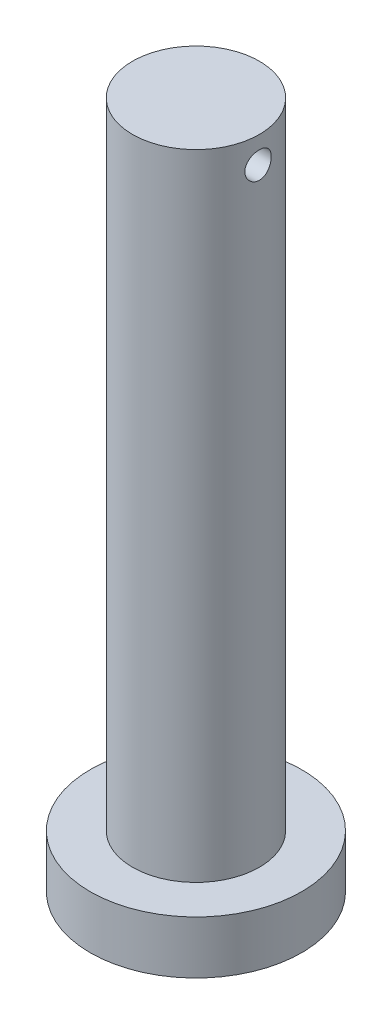
ISO-10303-21;
HEADER;
FILE_DESCRIPTION(('STEP AP214'),'2;1');
FILE_NAME('part.step','',(''),(''),'','','');
FILE_SCHEMA(('AUTOMOTIVE_DESIGN { 1 0 10303 214 1 1 1 1 }'));
ENDSEC;
DATA;
#1=APPLICATION_CONTEXT('core data for automotive mechanical design processes');
#2=APPLICATION_PROTOCOL_DEFINITION('international standard','automotive_design',2000,#1);
#3=PRODUCT_CONTEXT('',#1,'mechanical');
#4=PRODUCT('Part','Part','',(#3));
#5=PRODUCT_RELATED_PRODUCT_CATEGORY('part','',(#4));
#6=PRODUCT_DEFINITION_FORMATION('','',#4);
#7=PRODUCT_DEFINITION_CONTEXT('part definition',#1,'design');
#8=PRODUCT_DEFINITION('design','',#6,#7);
#9=PRODUCT_DEFINITION_SHAPE('','',#8);
#10=(LENGTH_UNIT() NAMED_UNIT(*) SI_UNIT(.MILLI.,.METRE.));
#11=(NAMED_UNIT(*) PLANE_ANGLE_UNIT() SI_UNIT($,.RADIAN.));
#12=(NAMED_UNIT(*) SI_UNIT($,.STERADIAN.) SOLID_ANGLE_UNIT());
#13=UNCERTAINTY_MEASURE_WITH_UNIT(LENGTH_MEASURE(1.E-05),#10,'distance_accuracy_value','');
#14=(GEOMETRIC_REPRESENTATION_CONTEXT(3) GLOBAL_UNCERTAINTY_ASSIGNED_CONTEXT((#13)) GLOBAL_UNIT_ASSIGNED_CONTEXT((#10,
#11,#12)) REPRESENTATION_CONTEXT('',''));
#15=CARTESIAN_POINT('',(0.,0.,0.));
#16=DIRECTION('',(0.,0.,1.));
#17=DIRECTION('',(1.,0.,0.));
#18=AXIS2_PLACEMENT_3D('',#15,#16,#17);
#19=CARTESIAN_POINT('',(0.,60.,0.));
#20=DIRECTION('',(0.,-1.,0.));
#21=DIRECTION('',(0.,0.,-1.));
#22=AXIS2_PLACEMENT_3D('',#19,#20,#21);
#23=CYLINDRICAL_SURFACE('',#22,6.);
#24=CARTESIAN_POINT('',(-5.86834729715275,57.5,-1.25));
#25=CARTESIAN_POINT('',(-5.86834869213645,57.569390615151,-1.249997508776));
#26=CARTESIAN_POINT('',(-5.86959145924544,57.6388119720152,-1.24420229433948));
#27=CARTESIAN_POINT('',(-5.87442015581798,57.7756863173172,-1.22119649233779));
#28=CARTESIAN_POINT('',(-5.87800788138388,57.8431377555064,-1.20397715440342));
#29=CARTESIAN_POINT('',(-5.8871029296193,57.9740723728349,-1.15868397507231));
#30=CARTESIAN_POINT('',(-5.89260825706945,58.0375595959918,-1.13062141248933));
#31=CARTESIAN_POINT('',(-5.90491581335741,58.1589244996456,-1.06446988601733));
#32=CARTESIAN_POINT('',(-5.91171798977622,58.21680240673,-1.0263813273582));
#33=CARTESIAN_POINT('',(-5.92596934661468,58.3261953751535,-0.940636399466089));
#34=CARTESIAN_POINT('',(-5.93342614373039,58.3776118936265,-0.892855554869674));
#35=CARTESIAN_POINT('',(-5.94807966802575,58.4717610686481,-0.789351223880641));
#36=CARTESIAN_POINT('',(-5.95527637609915,58.5144930882914,-0.733627155456006));
#37=CARTESIAN_POINT('',(-5.96868135118848,58.5904458880829,-0.615162052999591));
#38=CARTESIAN_POINT('',(-5.97487958631242,58.6235725264633,-0.552359428204943));
#39=CARTESIAN_POINT('',(-5.98550347343302,58.6787660528598,-0.421928551006721));
#40=CARTESIAN_POINT('',(-5.98992930561223,58.7008340651535,-0.354300789950593));
#41=CARTESIAN_POINT('',(-5.99645589892179,58.7329757611175,-0.217162904200505));
#42=CARTESIAN_POINT('',(-5.99858891959926,58.7432160171952,-0.14769338091636));
#43=CARTESIAN_POINT('',(-6.00040112580612,58.751931695757,-0.00799184883952697));
#44=CARTESIAN_POINT('',(-6.0000805670369,58.7504083441931,0.062240079736836));
#45=CARTESIAN_POINT('',(-5.99704658090511,58.7357653990433,0.200326586199569));
#46=CARTESIAN_POINT('',(-5.99437018956585,58.7228252810419,0.268201128726472));
#47=CARTESIAN_POINT('',(-5.98696720898885,58.6860013746687,0.40079374628975));
#48=CARTESIAN_POINT('',(-5.98224053291904,58.6621171227969,0.46551168751102));
#49=CARTESIAN_POINT('',(-5.97120767323924,58.6039199478745,0.590460005384681));
#50=CARTESIAN_POINT('',(-5.96489104125346,58.5695377057903,0.650657134981646));
#51=CARTESIAN_POINT('',(-5.95137300440189,58.4913719971596,0.764493456510644));
#52=CARTESIAN_POINT('',(-5.94417148958325,58.4475873617939,0.818131831816417));
#53=CARTESIAN_POINT('',(-5.92951700233276,58.3508783751089,0.918394203276914));
#54=CARTESIAN_POINT('',(-5.92206184975925,58.297796940018,0.964866487494797));
#55=CARTESIAN_POINT('',(-5.90786872648996,58.1845179510052,1.04827597240488));
#56=CARTESIAN_POINT('',(-5.9011307717716,58.1243202386128,1.0852129606998));
#57=CARTESIAN_POINT('',(-5.88912998409156,57.9982877451712,1.14856217138454));
#58=CARTESIAN_POINT('',(-5.88387085232125,57.9324393493065,1.17494805489727));
#59=CARTESIAN_POINT('',(-5.8754760641036,57.7971083806306,1.21623577538673));
#60=CARTESIAN_POINT('',(-5.87234010507182,57.7276263271919,1.23113924882349));
#61=CARTESIAN_POINT('',(-5.86860783239132,57.5883802936811,1.24880863867017));
#62=CARTESIAN_POINT('',(-5.86796551863474,57.518645415463,1.25179442917998));
#63=CARTESIAN_POINT('',(-5.86916952018704,57.3796741884599,1.24613693439294));
#64=CARTESIAN_POINT('',(-5.87101568152624,57.3104378090977,1.23749436857863));
#65=CARTESIAN_POINT('',(-5.87694538226166,57.1751794839419,1.20901558325484));
#66=CARTESIAN_POINT('',(-5.88100511282998,57.1091313328212,1.18929841376871));
#67=CARTESIAN_POINT('',(-5.8908833850312,56.9812760105584,1.13935810860919));
#68=CARTESIAN_POINT('',(-5.89670208191057,56.9194692143496,1.10913404556146));
#69=CARTESIAN_POINT('',(-5.90954501937191,56.8008935587838,1.03854598181484));
#70=CARTESIAN_POINT('',(-5.91658506648323,56.7442077955338,0.998045327353961));
#71=CARTESIAN_POINT('',(-5.93103483993908,56.6383567508449,0.908234440569878));
#72=CARTESIAN_POINT('',(-5.93844460766532,56.5891923137608,0.858923220505172));
#73=CARTESIAN_POINT('',(-5.95294924316736,56.4989372869028,0.751900450843339));
#74=CARTESIAN_POINT('',(-5.9600367471991,56.4579959049736,0.694061907614551));
#75=CARTESIAN_POINT('',(-5.97296708772407,56.386411247912,0.572200102216361));
#76=CARTESIAN_POINT('',(-5.97880997920818,56.3557675177625,0.508177113476883));
#77=CARTESIAN_POINT('',(-5.98856148270679,56.3058613206826,0.376142117847921));
#78=CARTESIAN_POINT('',(-5.99248163136497,56.2865308344557,0.308156710970196));
#79=CARTESIAN_POINT('',(-5.99799561410226,56.2595855959919,0.169813400503474));
#80=CARTESIAN_POINT('',(-5.99958975342889,56.2519693064673,0.0994558094616968));
#81=CARTESIAN_POINT('',(-6.00026408056941,56.2487323779515,-0.040213343470338));
#82=CARTESIAN_POINT('',(-5.99939113754811,56.2528881000053,-0.109519592177921));
#83=CARTESIAN_POINT('',(-5.99532874094472,56.2725806386529,-0.246422870373552));
#84=CARTESIAN_POINT('',(-5.99213932172839,56.2881172864068,-0.314019925202703));
#85=CARTESIAN_POINT('',(-5.98380460077544,56.3300277946486,-0.445431965492053));
#86=CARTESIAN_POINT('',(-5.97866453407556,56.3563726638531,-0.509256550004524));
#87=CARTESIAN_POINT('',(-5.96697995347704,56.419122397732,-0.631610567220743));
#88=CARTESIAN_POINT('',(-5.96043531730246,56.4555281383431,-0.690139538279512));
#89=CARTESIAN_POINT('',(-5.94651596786386,56.5381096679933,-0.801340321298262));
#90=CARTESIAN_POINT('',(-5.93912880302851,56.5844442880567,-0.853892633615928));
#91=CARTESIAN_POINT('',(-5.9244278681135,56.6852445009971,-0.950552741980386));
#92=CARTESIAN_POINT('',(-5.91711411595368,56.7397120299484,-0.994658521571231));
#93=CARTESIAN_POINT('',(-5.90329191643327,56.8560091024334,-1.07367451852767));
#94=CARTESIAN_POINT('',(-5.89679406702551,56.9179184114621,-1.10846928126994));
#95=CARTESIAN_POINT('',(-5.88547039658063,57.0468251560833,-1.16710627925306));
#96=CARTESIAN_POINT('',(-5.88064310352601,57.113818048453,-1.1909581629246));
#97=CARTESIAN_POINT('',(-5.87414004405196,57.2341062815684,-1.22256554131861));
#98=CARTESIAN_POINT('',(-5.87198163591589,57.2867295365931,-1.2328344900567));
#99=CARTESIAN_POINT('',(-5.86908475266778,57.392895780521,-1.24655254358404));
#100=CARTESIAN_POINT('',(-5.86834622039193,57.44643873231,-1.25000192292741));
#101=CARTESIAN_POINT('',(-5.86834729715275,57.5,-1.25));
#102=B_SPLINE_CURVE_WITH_KNOTS('',3,(#24,#25,#26,#27,#28,#29,#30,#31,#32,#33,#34,#35,#36,#37,
#38,#39,#40,#41,#42,#43,#44,#45,#46,#47,#48,#49,#50,#51,#52,#53,#54,#55,#56,#57,#58,#59,#60,#61,
#62,#63,#64,#65,#66,#67,#68,#69,#70,#71,#72,#73,#74,#75,#76,#77,#78,#79,#80,#81,#82,#83,#84,#85,
#86,#87,#88,#89,#90,#91,#92,#93,#94,#95,#96,#97,#98,#99,#100,#101),.UNSPECIFIED.,.T.,.F.,(4,2,2,
2,2,2,2,2,2,2,2,2,2,2,2,2,2,2,2,2,2,2,2,2,2,2,2,2,2,2,2,2,2,2,2,2,2,2,4),(0.,0.20797565407127,
0.41611079241747,0.624030014802724,0.831940834815788,1.04271333467884,1.25350128663874,
1.46629026266844,1.67905760106933,1.88879048859265,2.09850151896339,2.30497341416461,
2.51145405455871,2.71932871977949,2.9272292410426,3.13905862244914,3.35089272191629,
3.5632523733249,3.77558175387597,3.98397516009791,4.19235567296524,4.39853786231922,
4.60473825464031,4.81383917934652,5.02296356082187,5.23559458753344,5.44821621759041,
5.65954599648535,5.87084803959582,6.07816293922645,6.28547476332982,6.49223410585102,
6.69901145528174,6.90938318978574,7.11980508427536,7.33272651358124,7.54545984571989,
7.70599867585771,7.86653104261162),.UNSPECIFIED.);
#103=CARTESIAN_POINT('',(-5.86834729715275,57.5,-1.25));
#104=VERTEX_POINT('',#103);
#105=EDGE_CURVE('E36',#104,#104,#102,.T.);
#106=ORIENTED_EDGE('',*,*,#105,.T.);
#107=EDGE_LOOP('',(#106));
#108=FACE_BOUND('',#107,.T.);
#109=CARTESIAN_POINT('',(5.86834729715275,57.5,-1.25));
#110=CARTESIAN_POINT('',(5.86834869213645,57.430609384849,-1.249997508776));
#111=CARTESIAN_POINT('',(5.86959145924544,57.3611880279848,-1.24420229433948));
#112=CARTESIAN_POINT('',(5.87442015581798,57.2243136826827,-1.22119649233779));
#113=CARTESIAN_POINT('',(5.87800788138388,57.1568622444936,-1.20397715440342));
#114=CARTESIAN_POINT('',(5.8871029296193,57.0259276271651,-1.15868397507231));
#115=CARTESIAN_POINT('',(5.89260825706945,56.9624404040082,-1.13062141248933));
#116=CARTESIAN_POINT('',(5.90491581335741,56.8410755003544,-1.06446988601733));
#117=CARTESIAN_POINT('',(5.91171798977622,56.78319759327,-1.0263813273582));
#118=CARTESIAN_POINT('',(5.92596934661468,56.6738046248465,-0.940636399466089));
#119=CARTESIAN_POINT('',(5.93342614373039,56.6223881063735,-0.892855554869674));
#120=CARTESIAN_POINT('',(5.94807966802575,56.5282389313519,-0.789351223880641));
#121=CARTESIAN_POINT('',(5.95527637609915,56.4855069117086,-0.733627155456006));
#122=CARTESIAN_POINT('',(5.96868135118848,56.4095541119171,-0.615162052999591));
#123=CARTESIAN_POINT('',(5.97487958631242,56.3764274735367,-0.552359428204943));
#124=CARTESIAN_POINT('',(5.98550347343302,56.3212339471402,-0.421928551006721));
#125=CARTESIAN_POINT('',(5.98992930561223,56.2991659348465,-0.354300789950593));
#126=CARTESIAN_POINT('',(5.99645589892179,56.2670242388825,-0.217162904200505));
#127=CARTESIAN_POINT('',(5.99858891959926,56.2567839828048,-0.14769338091636));
#128=CARTESIAN_POINT('',(6.00040112580612,56.248068304243,-0.00799184883952697));
#129=CARTESIAN_POINT('',(6.0000805670369,56.2495916558069,0.062240079736836));
#130=CARTESIAN_POINT('',(5.99704658090511,56.2642346009567,0.200326586199569));
#131=CARTESIAN_POINT('',(5.99437018956585,56.2771747189581,0.268201128726472));
#132=CARTESIAN_POINT('',(5.98696720898885,56.3139986253313,0.40079374628975));
#133=CARTESIAN_POINT('',(5.98224053291904,56.3378828772031,0.46551168751102));
#134=CARTESIAN_POINT('',(5.97120767323924,56.3960800521255,0.590460005384681));
#135=CARTESIAN_POINT('',(5.96489104125346,56.4304622942096,0.650657134981646));
#136=CARTESIAN_POINT('',(5.95137300440189,56.5086280028404,0.764493456510644));
#137=CARTESIAN_POINT('',(5.94417148958325,56.5524126382061,0.818131831816417));
#138=CARTESIAN_POINT('',(5.92951700233276,56.649121624891,0.918394203276911));
#139=CARTESIAN_POINT('',(5.92206184975926,56.7022030599819,0.964866487494792));
#140=CARTESIAN_POINT('',(5.90786872648996,56.8154820489948,1.04827597240488));
#141=CARTESIAN_POINT('',(5.9011307717716,56.8756797613872,1.0852129606998));
#142=CARTESIAN_POINT('',(5.88912998409156,57.0017122548288,1.14856217138454));
#143=CARTESIAN_POINT('',(5.88387085232125,57.0675606506934,1.17494805489727));
#144=CARTESIAN_POINT('',(5.8754760641036,57.2028916193694,1.21623577538672));
#145=CARTESIAN_POINT('',(5.87234010507182,57.2723736728081,1.23113924882348));
#146=CARTESIAN_POINT('',(5.86860783239132,57.4116197063189,1.24880863867017));
#147=CARTESIAN_POINT('',(5.86796551863474,57.481354584537,1.25179442917998));
#148=CARTESIAN_POINT('',(5.86916952018704,57.6203258115401,1.24613693439294));
#149=CARTESIAN_POINT('',(5.87101568152624,57.6895621909023,1.23749436857863));
#150=CARTESIAN_POINT('',(5.87694538226166,57.8248205160581,1.20901558325484));
#151=CARTESIAN_POINT('',(5.88100511282998,57.8908686671788,1.18929841376871));
#152=CARTESIAN_POINT('',(5.8908833850312,58.0187239894416,1.13935810860919));
#153=CARTESIAN_POINT('',(5.89670208191057,58.0805307856504,1.10913404556146));
#154=CARTESIAN_POINT('',(5.90954501937191,58.1991064412162,1.03854598181485));
#155=CARTESIAN_POINT('',(5.91658506648323,58.2557922044662,0.998045327353962));
#156=CARTESIAN_POINT('',(5.93103483993908,58.3616432491551,0.90823444056988));
#157=CARTESIAN_POINT('',(5.93844460766532,58.4108076862392,0.858923220505173));
#158=CARTESIAN_POINT('',(5.95294924316736,58.5010627130972,0.751900450843339));
#159=CARTESIAN_POINT('',(5.9600367471991,58.5420040950264,0.694061907614551));
#160=CARTESIAN_POINT('',(5.97296708772407,58.613588752088,0.572200102216361));
#161=CARTESIAN_POINT('',(5.97880997920818,58.6442324822374,0.508177113476883));
#162=CARTESIAN_POINT('',(5.98856148270679,58.6941386793173,0.376142117847921));
#163=CARTESIAN_POINT('',(5.99248163136497,58.7134691655443,0.308156710970196));
#164=CARTESIAN_POINT('',(5.99799561410226,58.7404144040081,0.169813400503474));
#165=CARTESIAN_POINT('',(5.99958975342889,58.7480306935327,0.0994558094616968));
#166=CARTESIAN_POINT('',(6.00026408056941,58.7512676220485,-0.040213343470338));
#167=CARTESIAN_POINT('',(5.99939113754811,58.7471118999947,-0.109519592177921));
#168=CARTESIAN_POINT('',(5.99532874094472,58.7274193613471,-0.246422870373552));
#169=CARTESIAN_POINT('',(5.99213932172839,58.7118827135932,-0.314019925202703));
#170=CARTESIAN_POINT('',(5.98380460077544,58.6699722053514,-0.445431965492053));
#171=CARTESIAN_POINT('',(5.97866453407556,58.6436273361469,-0.509256550004524));
#172=CARTESIAN_POINT('',(5.96697995347704,58.580877602268,-0.631610567220743));
#173=CARTESIAN_POINT('',(5.96043531730246,58.5444718616569,-0.690139538279512));
#174=CARTESIAN_POINT('',(5.94651596786386,58.4618903320067,-0.801340321298262));
#175=CARTESIAN_POINT('',(5.93912880302851,58.4155557119433,-0.853892633615928));
#176=CARTESIAN_POINT('',(5.9244278681135,58.3147554990029,-0.950552741980386));
#177=CARTESIAN_POINT('',(5.91711411595368,58.2602879700516,-0.994658521571231));
#178=CARTESIAN_POINT('',(5.90329191643327,58.1439908975666,-1.07367451852767));
#179=CARTESIAN_POINT('',(5.89679406702551,58.0820815885379,-1.10846928126994));
#180=CARTESIAN_POINT('',(5.88547039658063,57.9531748439167,-1.16710627925306));
#181=CARTESIAN_POINT('',(5.88064310352601,57.886181951547,-1.1909581629246));
#182=CARTESIAN_POINT('',(5.87414004405196,57.7658937184316,-1.22256554131861));
#183=CARTESIAN_POINT('',(5.87198163591589,57.7132704634069,-1.23283449005671));
#184=CARTESIAN_POINT('',(5.86908475266778,57.607104219479,-1.24655254358404));
#185=CARTESIAN_POINT('',(5.86834622039193,57.55356126769,-1.25000192292741));
#186=CARTESIAN_POINT('',(5.86834729715275,57.5,-1.25));
#187=B_SPLINE_CURVE_WITH_KNOTS('',3,(#109,#110,#111,#112,#113,#114,#115,#116,#117,#118,#119,
#120,#121,#122,#123,#124,#125,#126,#127,#128,#129,#130,#131,#132,#133,#134,#135,#136,#137,#138,
#139,#140,#141,#142,#143,#144,#145,#146,#147,#148,#149,#150,#151,#152,#153,#154,#155,#156,#157,
#158,#159,#160,#161,#162,#163,#164,#165,#166,#167,#168,#169,#170,#171,#172,#173,#174,#175,#176,
#177,#178,#179,#180,#181,#182,#183,#184,#185,#186),.UNSPECIFIED.,.T.,.F.,(4,2,2,2,2,2,2,2,2,2,2,
2,2,2,2,2,2,2,2,2,2,2,2,2,2,2,2,2,2,2,2,2,2,2,2,2,2,2,4),(0.,0.20797565407127,0.41611079241747,
0.624030014802731,0.831940834815788,1.04271333467884,1.25350128663874,1.46629026266844,
1.67905760106933,1.88879048859265,2.09850151896339,2.30497341416461,2.51145405455871,
2.71932871977949,2.9272292410426,3.13905862244913,3.35089272191629,3.56325237332487,
3.77558175387597,3.98397516009791,4.19235567296524,4.39853786231923,4.60473825464031,
4.81383917934651,5.02296356082187,5.23559458753344,5.44821621759041,5.65954599648535,
5.87084803959582,6.07816293922645,6.28547476332982,6.49223410585102,6.69901145528174,
6.90938318978574,7.11980508427536,7.33272651358124,7.54545984571989,7.70599867585771,
7.86653104261162),.UNSPECIFIED.);
#188=CARTESIAN_POINT('',(5.86834729715275,57.5,-1.25));
#189=VERTEX_POINT('',#188);
#190=EDGE_CURVE('E53',#189,#189,#187,.T.);
#191=ORIENTED_EDGE('',*,*,#190,.T.);
#192=EDGE_LOOP('',(#191));
#193=FACE_BOUND('',#192,.T.);
#194=CARTESIAN_POINT('',(0.,60.,0.));
#195=DIRECTION('',(0.,1.,0.));
#196=DIRECTION('',(0.,0.,1.));
#197=AXIS2_PLACEMENT_3D('',#194,#195,#196);
#198=CIRCLE('',#197,6.);
#199=CARTESIAN_POINT('',(0.,60.,6.));
#200=VERTEX_POINT('',#199);
#201=EDGE_CURVE('E10',#200,#200,#198,.T.);
#202=ORIENTED_EDGE('',*,*,#201,.F.);
#203=EDGE_LOOP('',(#202));
#204=FACE_BOUND('',#203,.T.);
#205=CARTESIAN_POINT('',(0.,0.,0.));
#206=DIRECTION('',(0.,1.,0.));
#207=DIRECTION('',(0.,0.,1.));
#208=AXIS2_PLACEMENT_3D('',#205,#206,#207);
#209=CIRCLE('',#208,6.);
#210=CARTESIAN_POINT('',(0.,0.,6.));
#211=VERTEX_POINT('',#210);
#212=EDGE_CURVE('E43',#211,#211,#209,.T.);
#213=ORIENTED_EDGE('',*,*,#212,.T.);
#214=EDGE_LOOP('',(#213));
#215=FACE_BOUND('',#214,.T.);
#216=ADVANCED_FACE('F32',(#108,#193,#204,#215),#23,.T.);
#217=CARTESIAN_POINT('',(0.,60.,0.));
#218=DIRECTION('',(0.,1.,0.));
#219=DIRECTION('',(0.,0.,1.));
#220=AXIS2_PLACEMENT_3D('',#217,#218,#219);
#221=PLANE('',#220);
#222=ORIENTED_EDGE('',*,*,#201,.T.);
#223=EDGE_LOOP('',(#222));
#224=FACE_BOUND('',#223,.T.);
#225=ADVANCED_FACE('F73',(#224),#221,.T.);
#226=CARTESIAN_POINT('',(0.,-5.,0.));
#227=DIRECTION('',(0.,1.,0.));
#228=DIRECTION('',(0.,0.,1.));
#229=AXIS2_PLACEMENT_3D('',#226,#227,#228);
#230=CYLINDRICAL_SURFACE('',#229,10.);
#231=CARTESIAN_POINT('',(0.,-5.,0.));
#232=DIRECTION('',(0.,1.,0.));
#233=DIRECTION('',(0.,0.,1.));
#234=AXIS2_PLACEMENT_3D('',#231,#232,#233);
#235=CIRCLE('',#234,10.);
#236=CARTESIAN_POINT('',(0.,-5.,10.));
#237=VERTEX_POINT('',#236);
#238=EDGE_CURVE('E48',#237,#237,#235,.T.);
#239=ORIENTED_EDGE('',*,*,#238,.T.);
#240=EDGE_LOOP('',(#239));
#241=FACE_BOUND('',#240,.T.);
#242=CARTESIAN_POINT('',(0.,0.,0.));
#243=DIRECTION('',(0.,1.,0.));
#244=DIRECTION('',(0.,0.,1.));
#245=AXIS2_PLACEMENT_3D('',#242,#243,#244);
#246=CIRCLE('',#245,10.);
#247=CARTESIAN_POINT('',(0.,0.,10.));
#248=VERTEX_POINT('',#247);
#249=EDGE_CURVE('E51',#248,#248,#246,.T.);
#250=ORIENTED_EDGE('',*,*,#249,.F.);
#251=EDGE_LOOP('',(#250));
#252=FACE_BOUND('',#251,.T.);
#253=ADVANCED_FACE('F67',(#241,#252),#230,.T.);
#254=CARTESIAN_POINT('',(0.,-5.,0.));
#255=DIRECTION('',(0.,1.,0.));
#256=DIRECTION('',(0.,0.,1.));
#257=AXIS2_PLACEMENT_3D('',#254,#255,#256);
#258=PLANE('',#257);
#259=ORIENTED_EDGE('',*,*,#238,.F.);
#260=EDGE_LOOP('',(#259));
#261=FACE_BOUND('',#260,.T.);
#262=ADVANCED_FACE('F63',(#261),#258,.F.);
#263=CARTESIAN_POINT('',(0.,0.,0.));
#264=DIRECTION('',(0.,1.,0.));
#265=DIRECTION('',(0.,0.,1.));
#266=AXIS2_PLACEMENT_3D('',#263,#264,#265);
#267=PLANE('',#266);
#268=ORIENTED_EDGE('',*,*,#212,.F.);
#269=EDGE_LOOP('',(#268));
#270=FACE_BOUND('',#269,.T.);
#271=ORIENTED_EDGE('',*,*,#249,.T.);
#272=EDGE_LOOP('',(#271));
#273=FACE_BOUND('',#272,.T.);
#274=ADVANCED_FACE('F61',(#270,#273),#267,.T.);
#275=CARTESIAN_POINT('',(-10.,57.5,0.));
#276=DIRECTION('',(1.,0.,0.));
#277=DIRECTION('',(0.,0.,-1.));
#278=AXIS2_PLACEMENT_3D('',#275,#276,#277);
#279=CYLINDRICAL_SURFACE('',#278,1.25);
#280=ORIENTED_EDGE('',*,*,#190,.F.);
#281=EDGE_LOOP('',(#280));
#282=FACE_BOUND('',#281,.T.);
#283=ORIENTED_EDGE('',*,*,#105,.F.);
#284=EDGE_LOOP('',(#283));
#285=FACE_BOUND('',#284,.T.);
#286=ADVANCED_FACE('F57',(#282,#285),#279,.F.);
#287=CLOSED_SHELL('',(#216,#225,#253,#262,#274,#286));
#288=MANIFOLD_SOLID_BREP('B2',#287);
#289=ADVANCED_BREP_SHAPE_REPRESENTATION('',(#18,#288),#14);
#290=SHAPE_DEFINITION_REPRESENTATION(#9,#289);
ENDSEC;
END-ISO-10303-21;
